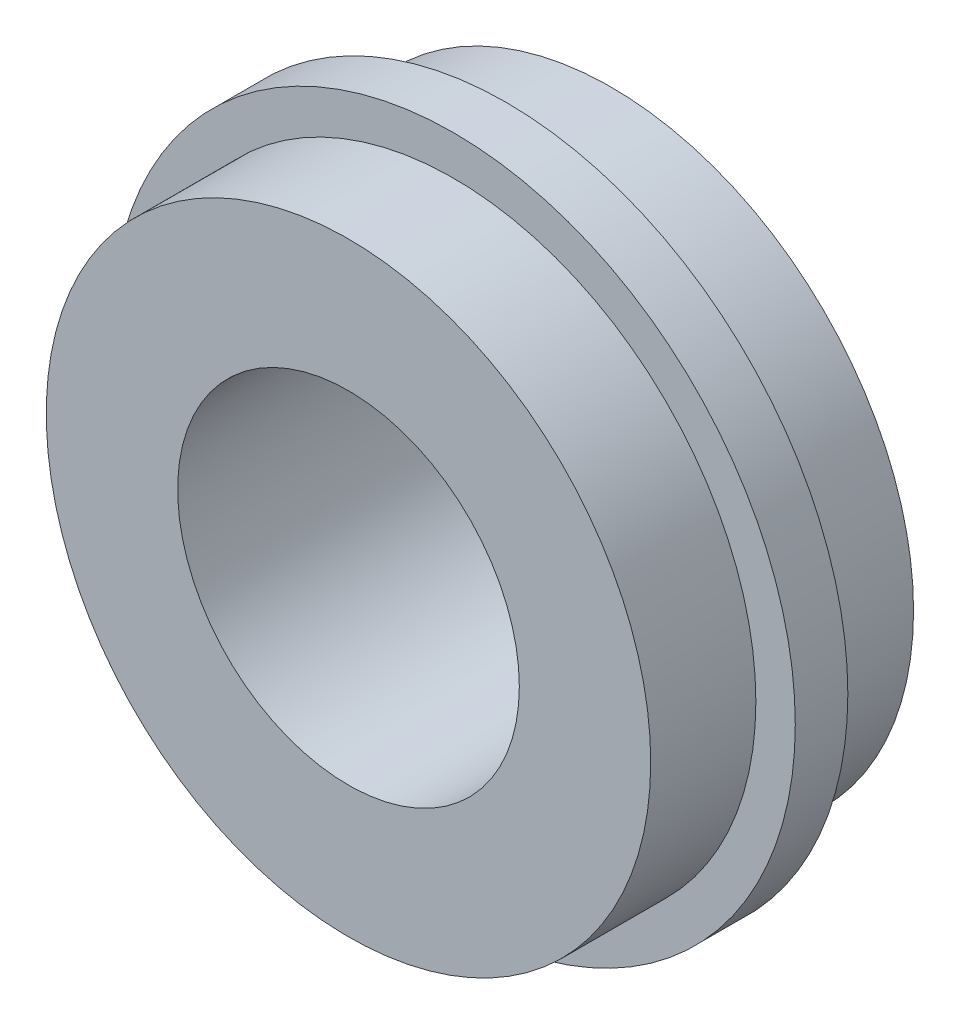
ISO-10303-21;
HEADER;
FILE_DESCRIPTION(('STEP AP214'),'2;1');
FILE_NAME('part.step','',(''),(''),'','','');
FILE_SCHEMA(('AUTOMOTIVE_DESIGN { 1 0 10303 214 1 1 1 1 }'));
ENDSEC;
DATA;
#1=APPLICATION_CONTEXT('core data for automotive mechanical design processes');
#2=APPLICATION_PROTOCOL_DEFINITION('international standard','automotive_design',2000,#1);
#3=PRODUCT_CONTEXT('',#1,'mechanical');
#4=PRODUCT('Part','Part','',(#3));
#5=PRODUCT_RELATED_PRODUCT_CATEGORY('part','',(#4));
#6=PRODUCT_DEFINITION_FORMATION('','',#4);
#7=PRODUCT_DEFINITION_CONTEXT('part definition',#1,'design');
#8=PRODUCT_DEFINITION('design','',#6,#7);
#9=PRODUCT_DEFINITION_SHAPE('','',#8);
#10=(LENGTH_UNIT() NAMED_UNIT(*) SI_UNIT(.MILLI.,.METRE.));
#11=(NAMED_UNIT(*) PLANE_ANGLE_UNIT() SI_UNIT($,.RADIAN.));
#12=(NAMED_UNIT(*) SI_UNIT($,.STERADIAN.) SOLID_ANGLE_UNIT());
#13=UNCERTAINTY_MEASURE_WITH_UNIT(LENGTH_MEASURE(1.E-05),#10,'distance_accuracy_value','');
#14=(GEOMETRIC_REPRESENTATION_CONTEXT(3) GLOBAL_UNCERTAINTY_ASSIGNED_CONTEXT((#13)) GLOBAL_UNIT_ASSIGNED_CONTEXT((#10,
#11,#12)) REPRESENTATION_CONTEXT('',''));
#15=CARTESIAN_POINT('',(0.,0.,0.));
#16=DIRECTION('',(0.,0.,1.));
#17=DIRECTION('',(1.,0.,0.));
#18=AXIS2_PLACEMENT_3D('',#15,#16,#17);
#19=CARTESIAN_POINT('',(0.,0.,0.));
#20=DIRECTION('',(0.,0.,1.));
#21=DIRECTION('',(1.,0.,0.));
#22=AXIS2_PLACEMENT_3D('',#19,#20,#21);
#23=CYLINDRICAL_SURFACE('',#22,6.5);
#24=CARTESIAN_POINT('',(0.,0.,5.));
#25=DIRECTION('',(0.,0.,1.));
#26=DIRECTION('',(1.,0.,0.));
#27=AXIS2_PLACEMENT_3D('',#24,#25,#26);
#28=CIRCLE('',#27,6.5);
#29=CARTESIAN_POINT('',(6.5,0.,5.));
#30=VERTEX_POINT('',#29);
#31=EDGE_CURVE('E10',#30,#30,#28,.T.);
#32=ORIENTED_EDGE('',*,*,#31,.T.);
#33=EDGE_LOOP('',(#32));
#34=FACE_BOUND('',#33,.T.);
#35=CARTESIAN_POINT('',(0.,0.,-5.));
#36=DIRECTION('',(0.,0.,1.));
#37=DIRECTION('',(1.,0.,0.));
#38=AXIS2_PLACEMENT_3D('',#35,#36,#37);
#39=CIRCLE('',#38,6.5);
#40=CARTESIAN_POINT('',(6.5,0.,-5.));
#41=VERTEX_POINT('',#40);
#42=EDGE_CURVE('E60',#41,#41,#39,.T.);
#43=ORIENTED_EDGE('',*,*,#42,.F.);
#44=EDGE_LOOP('',(#43));
#45=FACE_BOUND('',#44,.T.);
#46=ADVANCED_FACE('F32',(#34,#45),#23,.F.);
#47=CARTESIAN_POINT('',(6.5,0.,5.));
#48=DIRECTION('',(0.,0.,1.));
#49=DIRECTION('',(1.,0.,0.));
#50=AXIS2_PLACEMENT_3D('',#47,#48,#49);
#51=PLANE('',#50);
#52=CARTESIAN_POINT('',(0.,0.,5.));
#53=DIRECTION('',(0.,0.,1.));
#54=DIRECTION('',(1.,0.,0.));
#55=AXIS2_PLACEMENT_3D('',#52,#53,#54);
#56=CIRCLE('',#55,11.5);
#57=CARTESIAN_POINT('',(11.5,0.,5.));
#58=VERTEX_POINT('',#57);
#59=EDGE_CURVE('E38',#58,#58,#56,.T.);
#60=ORIENTED_EDGE('',*,*,#59,.T.);
#61=EDGE_LOOP('',(#60));
#62=FACE_BOUND('',#61,.T.);
#63=ORIENTED_EDGE('',*,*,#31,.F.);
#64=EDGE_LOOP('',(#63));
#65=FACE_BOUND('',#64,.T.);
#66=ADVANCED_FACE('F68',(#62,#65),#51,.T.);
#67=CARTESIAN_POINT('',(0.,0.,0.));
#68=DIRECTION('',(0.,0.,1.));
#69=DIRECTION('',(1.,0.,0.));
#70=AXIS2_PLACEMENT_3D('',#67,#68,#69);
#71=CYLINDRICAL_SURFACE('',#70,11.5);
#72=CARTESIAN_POINT('',(0.,0.,1.));
#73=DIRECTION('',(0.,0.,1.));
#74=DIRECTION('',(1.,0.,0.));
#75=AXIS2_PLACEMENT_3D('',#72,#73,#74);
#76=CIRCLE('',#75,11.5);
#77=CARTESIAN_POINT('',(11.5,0.,1.));
#78=VERTEX_POINT('',#77);
#79=EDGE_CURVE('E42',#78,#78,#76,.T.);
#80=ORIENTED_EDGE('',*,*,#79,.T.);
#81=EDGE_LOOP('',(#80));
#82=FACE_BOUND('',#81,.T.);
#83=ORIENTED_EDGE('',*,*,#59,.F.);
#84=EDGE_LOOP('',(#83));
#85=FACE_BOUND('',#84,.T.);
#86=ADVANCED_FACE('F72',(#82,#85),#71,.T.);
#87=CARTESIAN_POINT('',(11.5,0.,1.));
#88=DIRECTION('',(0.,0.,1.));
#89=DIRECTION('',(1.,0.,0.));
#90=AXIS2_PLACEMENT_3D('',#87,#88,#89);
#91=PLANE('',#90);
#92=CARTESIAN_POINT('',(0.,0.,1.));
#93=DIRECTION('',(0.,0.,1.));
#94=DIRECTION('',(1.,0.,0.));
#95=AXIS2_PLACEMENT_3D('',#92,#93,#94);
#96=CIRCLE('',#95,13.);
#97=CARTESIAN_POINT('',(13.,0.,1.));
#98=VERTEX_POINT('',#97);
#99=EDGE_CURVE('E46',#98,#98,#96,.T.);
#100=ORIENTED_EDGE('',*,*,#99,.T.);
#101=EDGE_LOOP('',(#100));
#102=FACE_BOUND('',#101,.T.);
#103=ORIENTED_EDGE('',*,*,#79,.F.);
#104=EDGE_LOOP('',(#103));
#105=FACE_BOUND('',#104,.T.);
#106=ADVANCED_FACE('F76',(#102,#105),#91,.T.);
#107=CARTESIAN_POINT('',(0.,0.,0.));
#108=DIRECTION('',(0.,0.,1.));
#109=DIRECTION('',(1.,0.,0.));
#110=AXIS2_PLACEMENT_3D('',#107,#108,#109);
#111=CYLINDRICAL_SURFACE('',#110,13.);
#112=CARTESIAN_POINT('',(0.,0.,-1.));
#113=DIRECTION('',(0.,0.,1.));
#114=DIRECTION('',(1.,0.,0.));
#115=AXIS2_PLACEMENT_3D('',#112,#113,#114);
#116=CIRCLE('',#115,13.);
#117=CARTESIAN_POINT('',(13.,0.,-1.));
#118=VERTEX_POINT('',#117);
#119=EDGE_CURVE('E51',#118,#118,#116,.T.);
#120=ORIENTED_EDGE('',*,*,#119,.T.);
#121=EDGE_LOOP('',(#120));
#122=FACE_BOUND('',#121,.T.);
#123=ORIENTED_EDGE('',*,*,#99,.F.);
#124=EDGE_LOOP('',(#123));
#125=FACE_BOUND('',#124,.T.);
#126=ADVANCED_FACE('F83',(#122,#125),#111,.T.);
#127=CARTESIAN_POINT('',(11.5,0.,-1.));
#128=DIRECTION('',(0.,0.,-1.));
#129=DIRECTION('',(-1.,0.,0.));
#130=AXIS2_PLACEMENT_3D('',#127,#128,#129);
#131=PLANE('',#130);
#132=CARTESIAN_POINT('',(0.,0.,-1.));
#133=DIRECTION('',(0.,0.,1.));
#134=DIRECTION('',(1.,0.,0.));
#135=AXIS2_PLACEMENT_3D('',#132,#133,#134);
#136=CIRCLE('',#135,11.5);
#137=CARTESIAN_POINT('',(11.5,0.,-1.));
#138=VERTEX_POINT('',#137);
#139=EDGE_CURVE('E54',#138,#138,#136,.T.);
#140=ORIENTED_EDGE('',*,*,#139,.T.);
#141=EDGE_LOOP('',(#140));
#142=FACE_BOUND('',#141,.T.);
#143=ORIENTED_EDGE('',*,*,#119,.F.);
#144=EDGE_LOOP('',(#143));
#145=FACE_BOUND('',#144,.T.);
#146=ADVANCED_FACE('F87',(#142,#145),#131,.T.);
#147=CARTESIAN_POINT('',(0.,0.,0.));
#148=DIRECTION('',(0.,0.,1.));
#149=DIRECTION('',(1.,0.,0.));
#150=AXIS2_PLACEMENT_3D('',#147,#148,#149);
#151=CYLINDRICAL_SURFACE('',#150,11.5);
#152=CARTESIAN_POINT('',(0.,0.,-5.));
#153=DIRECTION('',(0.,0.,1.));
#154=DIRECTION('',(1.,0.,0.));
#155=AXIS2_PLACEMENT_3D('',#152,#153,#154);
#156=CIRCLE('',#155,11.5);
#157=CARTESIAN_POINT('',(11.5,0.,-5.));
#158=VERTEX_POINT('',#157);
#159=EDGE_CURVE('E57',#158,#158,#156,.T.);
#160=ORIENTED_EDGE('',*,*,#159,.T.);
#161=EDGE_LOOP('',(#160));
#162=FACE_BOUND('',#161,.T.);
#163=ORIENTED_EDGE('',*,*,#139,.F.);
#164=EDGE_LOOP('',(#163));
#165=FACE_BOUND('',#164,.T.);
#166=ADVANCED_FACE('F91',(#162,#165),#151,.T.);
#167=CARTESIAN_POINT('',(6.5,0.,-5.));
#168=DIRECTION('',(0.,0.,-1.));
#169=DIRECTION('',(-1.,0.,0.));
#170=AXIS2_PLACEMENT_3D('',#167,#168,#169);
#171=PLANE('',#170);
#172=ORIENTED_EDGE('',*,*,#42,.T.);
#173=EDGE_LOOP('',(#172));
#174=FACE_BOUND('',#173,.T.);
#175=ORIENTED_EDGE('',*,*,#159,.F.);
#176=EDGE_LOOP('',(#175));
#177=FACE_BOUND('',#176,.T.);
#178=ADVANCED_FACE('F64',(#174,#177),#171,.T.);
#179=CLOSED_SHELL('',(#46,#66,#86,#106,#126,#146,#166,#178));
#180=MANIFOLD_SOLID_BREP('B2',#179);
#181=ADVANCED_BREP_SHAPE_REPRESENTATION('',(#18,#180),#14);
#182=SHAPE_DEFINITION_REPRESENTATION(#9,#181);
ENDSEC;
END-ISO-10303-21;
